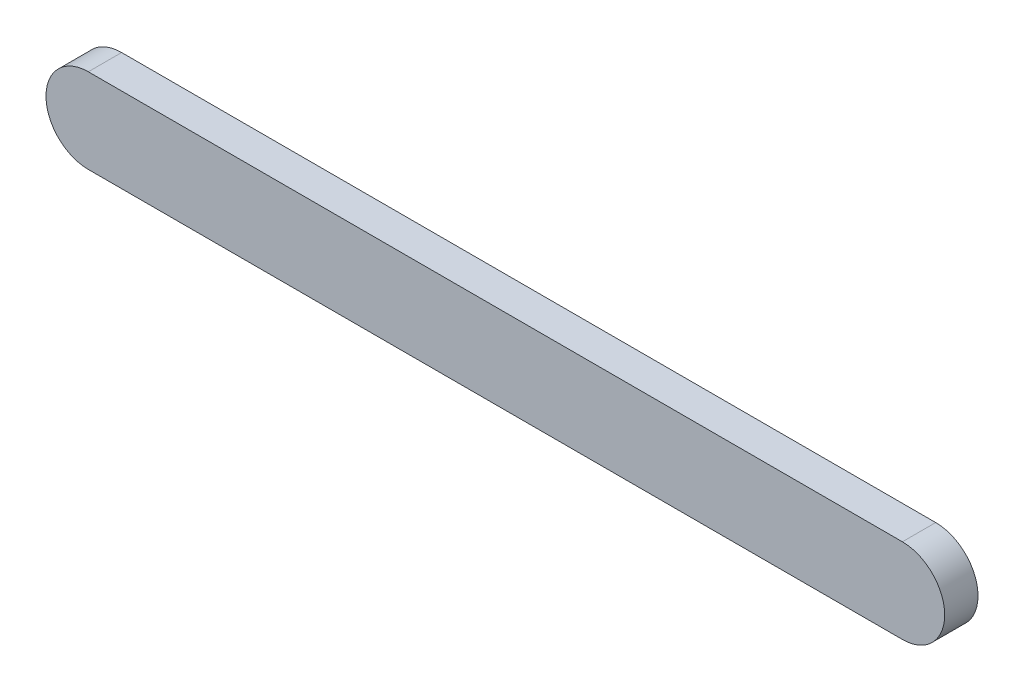
ISO-10303-21;
HEADER;
FILE_DESCRIPTION(('STEP AP214'),'2;1');
FILE_NAME('part.step','',(''),(''),'','','');
FILE_SCHEMA(('AUTOMOTIVE_DESIGN { 1 0 10303 214 1 1 1 1 }'));
ENDSEC;
DATA;
#1=APPLICATION_CONTEXT('core data for automotive mechanical design processes');
#2=APPLICATION_PROTOCOL_DEFINITION('international standard','automotive_design',2000,#1);
#3=PRODUCT_CONTEXT('',#1,'mechanical');
#4=PRODUCT('Part','Part','',(#3));
#5=PRODUCT_RELATED_PRODUCT_CATEGORY('part','',(#4));
#6=PRODUCT_DEFINITION_FORMATION('','',#4);
#7=PRODUCT_DEFINITION_CONTEXT('part definition',#1,'design');
#8=PRODUCT_DEFINITION('design','',#6,#7);
#9=PRODUCT_DEFINITION_SHAPE('','',#8);
#10=(LENGTH_UNIT() NAMED_UNIT(*) SI_UNIT(.MILLI.,.METRE.));
#11=(NAMED_UNIT(*) PLANE_ANGLE_UNIT() SI_UNIT($,.RADIAN.));
#12=(NAMED_UNIT(*) SI_UNIT($,.STERADIAN.) SOLID_ANGLE_UNIT());
#13=UNCERTAINTY_MEASURE_WITH_UNIT(LENGTH_MEASURE(1.E-05),#10,'distance_accuracy_value','');
#14=(GEOMETRIC_REPRESENTATION_CONTEXT(3) GLOBAL_UNCERTAINTY_ASSIGNED_CONTEXT((#13)) GLOBAL_UNIT_ASSIGNED_CONTEXT((#10,
#11,#12)) REPRESENTATION_CONTEXT('',''));
#15=CARTESIAN_POINT('',(0.,0.,0.));
#16=DIRECTION('',(0.,0.,1.));
#17=DIRECTION('',(1.,0.,0.));
#18=AXIS2_PLACEMENT_3D('',#15,#16,#17);
#19=CARTESIAN_POINT('',(93.6894748,60.96,0.));
#20=DIRECTION('',(0.,1.,0.));
#21=DIRECTION('',(1.,0.,0.));
#22=AXIS2_PLACEMENT_3D('',#19,#20,#21);
#23=PLANE('',#22);
#24=DIRECTION('',(1.,0.,0.));
#25=VECTOR('',#24,1.);
#26=CARTESIAN_POINT('',(93.6894748,60.96,0.1999996));
#27=LINE('',#26,#25);
#28=CARTESIAN_POINT('',(93.6894748,60.96,0.1999996));
#29=VERTEX_POINT('',#28);
#30=CARTESIAN_POINT('',(98.5774,60.96,0.1999996));
#31=VERTEX_POINT('',#30);
#32=EDGE_CURVE('E11',#29,#31,#27,.T.);
#33=ORIENTED_EDGE('',*,*,#32,.F.);
#34=DIRECTION('',(0.,0.,1.));
#35=VECTOR('',#34,1.);
#36=CARTESIAN_POINT('',(93.6894748,60.96,0.));
#37=LINE('',#36,#35);
#38=CARTESIAN_POINT('',(93.6894748,60.96,0.));
#39=VERTEX_POINT('',#38);
#40=EDGE_CURVE('E24',#39,#29,#37,.T.);
#41=ORIENTED_EDGE('',*,*,#40,.F.);
#42=DIRECTION('',(1.,0.,0.));
#43=VECTOR('',#42,1.);
#44=CARTESIAN_POINT('',(93.6894748,60.96,0.));
#45=LINE('',#44,#43);
#46=CARTESIAN_POINT('',(98.5774,60.96,0.));
#47=VERTEX_POINT('',#46);
#48=EDGE_CURVE('E75',#39,#47,#45,.T.);
#49=ORIENTED_EDGE('',*,*,#48,.T.);
#50=DIRECTION('',(0.,0.,1.));
#51=VECTOR('',#50,1.);
#52=CARTESIAN_POINT('',(98.5774,60.96,0.));
#53=LINE('',#52,#51);
#54=EDGE_CURVE('E37',#47,#31,#53,.T.);
#55=ORIENTED_EDGE('',*,*,#54,.T.);
#56=EDGE_LOOP('',(#33,#41,#49,#55));
#57=FACE_BOUND('',#56,.T.);
#58=ADVANCED_FACE('F17',(#57),#23,.F.);
#59=CARTESIAN_POINT('',(98.5774,61.214,0.));
#60=DIRECTION('',(0.,0.,-1.));
#61=DIRECTION('',(0.,-1.,0.));
#62=AXIS2_PLACEMENT_3D('',#59,#60,#61);
#63=CYLINDRICAL_SURFACE('',#62,0.254000000000003);
#64=CARTESIAN_POINT('',(98.5774,61.214,0.1999996));
#65=DIRECTION('',(0.,0.,1.));
#66=DIRECTION('',(0.,-1.,0.));
#67=AXIS2_PLACEMENT_3D('',#64,#65,#66);
#68=CIRCLE('',#67,0.254000000000003);
#69=CARTESIAN_POINT('',(98.5774,61.468,0.1999996));
#70=VERTEX_POINT('',#69);
#71=EDGE_CURVE('E83',#31,#70,#68,.T.);
#72=ORIENTED_EDGE('',*,*,#71,.F.);
#73=ORIENTED_EDGE('',*,*,#54,.F.);
#74=CARTESIAN_POINT('',(98.5774,61.214,0.));
#75=DIRECTION('',(0.,0.,1.));
#76=DIRECTION('',(0.,-1.,0.));
#77=AXIS2_PLACEMENT_3D('',#74,#75,#76);
#78=CIRCLE('',#77,0.254000000000003);
#79=CARTESIAN_POINT('',(98.5774,61.468,0.));
#80=VERTEX_POINT('',#79);
#81=EDGE_CURVE('E81',#47,#80,#78,.T.);
#82=ORIENTED_EDGE('',*,*,#81,.T.);
#83=DIRECTION('',(0.,0.,1.));
#84=VECTOR('',#83,1.);
#85=CARTESIAN_POINT('',(98.5774,61.468,0.));
#86=LINE('',#85,#84);
#87=EDGE_CURVE('E67',#80,#70,#86,.T.);
#88=ORIENTED_EDGE('',*,*,#87,.T.);
#89=EDGE_LOOP('',(#72,#73,#82,#88));
#90=FACE_BOUND('',#89,.T.);
#91=ADVANCED_FACE('F89',(#90),#63,.T.);
#92=CARTESIAN_POINT('',(98.5774,61.468,0.));
#93=DIRECTION('',(0.,-1.,0.));
#94=DIRECTION('',(-1.,0.,0.));
#95=AXIS2_PLACEMENT_3D('',#92,#93,#94);
#96=PLANE('',#95);
#97=DIRECTION('',(-1.,0.,0.));
#98=VECTOR('',#97,1.);
#99=CARTESIAN_POINT('',(98.5774,61.468,0.1999996));
#100=LINE('',#99,#98);
#101=CARTESIAN_POINT('',(93.6894748,61.468,0.1999996));
#102=VERTEX_POINT('',#101);
#103=EDGE_CURVE('E71',#70,#102,#100,.T.);
#104=ORIENTED_EDGE('',*,*,#103,.F.);
#105=ORIENTED_EDGE('',*,*,#87,.F.);
#106=DIRECTION('',(-1.,0.,0.));
#107=VECTOR('',#106,1.);
#108=CARTESIAN_POINT('',(98.5774,61.468,0.));
#109=LINE('',#108,#107);
#110=CARTESIAN_POINT('',(93.6894748,61.468,0.));
#111=VERTEX_POINT('',#110);
#112=EDGE_CURVE('E63',#80,#111,#109,.T.);
#113=ORIENTED_EDGE('',*,*,#112,.T.);
#114=DIRECTION('',(0.,0.,1.));
#115=VECTOR('',#114,1.);
#116=CARTESIAN_POINT('',(93.6894748,61.468,0.));
#117=LINE('',#116,#115);
#118=EDGE_CURVE('E53',#111,#102,#117,.T.);
#119=ORIENTED_EDGE('',*,*,#118,.T.);
#120=EDGE_LOOP('',(#104,#105,#113,#119));
#121=FACE_BOUND('',#120,.T.);
#122=ADVANCED_FACE('F66',(#121),#96,.F.);
#123=CARTESIAN_POINT('',(93.6894748,61.214,0.));
#124=DIRECTION('',(0.,0.,-1.));
#125=DIRECTION('',(0.,1.,0.));
#126=AXIS2_PLACEMENT_3D('',#123,#124,#125);
#127=CYLINDRICAL_SURFACE('',#126,0.254000000000003);
#128=CARTESIAN_POINT('',(93.6894748,61.214,0.1999996));
#129=DIRECTION('',(0.,0.,1.));
#130=DIRECTION('',(0.,1.,0.));
#131=AXIS2_PLACEMENT_3D('',#128,#129,#130);
#132=CIRCLE('',#131,0.254000000000003);
#133=EDGE_CURVE('E59',#102,#29,#132,.T.);
#134=ORIENTED_EDGE('',*,*,#133,.F.);
#135=ORIENTED_EDGE('',*,*,#118,.F.);
#136=CARTESIAN_POINT('',(93.6894748,61.214,0.));
#137=DIRECTION('',(0.,0.,1.));
#138=DIRECTION('',(0.,1.,0.));
#139=AXIS2_PLACEMENT_3D('',#136,#137,#138);
#140=CIRCLE('',#139,0.254000000000003);
#141=EDGE_CURVE('E57',#111,#39,#140,.T.);
#142=ORIENTED_EDGE('',*,*,#141,.T.);
#143=ORIENTED_EDGE('',*,*,#40,.T.);
#144=EDGE_LOOP('',(#134,#135,#142,#143));
#145=FACE_BOUND('',#144,.T.);
#146=ADVANCED_FACE('F55',(#145),#127,.T.);
#147=CARTESIAN_POINT('',(93.6894748,60.96,0.));
#148=DIRECTION('',(0.,0.,-1.));
#149=DIRECTION('',(-1.,0.,0.));
#150=AXIS2_PLACEMENT_3D('',#147,#148,#149);
#151=PLANE('',#150);
#152=ORIENTED_EDGE('',*,*,#141,.F.);
#153=ORIENTED_EDGE('',*,*,#112,.F.);
#154=ORIENTED_EDGE('',*,*,#81,.F.);
#155=ORIENTED_EDGE('',*,*,#48,.F.);
#156=EDGE_LOOP('',(#152,#153,#154,#155));
#157=FACE_BOUND('',#156,.T.);
#158=ADVANCED_FACE('F74',(#157),#151,.T.);
#159=CARTESIAN_POINT('',(93.6894748,60.96,0.1999996));
#160=DIRECTION('',(0.,0.,-1.));
#161=DIRECTION('',(-1.,0.,0.));
#162=AXIS2_PLACEMENT_3D('',#159,#160,#161);
#163=PLANE('',#162);
#164=ORIENTED_EDGE('',*,*,#32,.T.);
#165=ORIENTED_EDGE('',*,*,#71,.T.);
#166=ORIENTED_EDGE('',*,*,#103,.T.);
#167=ORIENTED_EDGE('',*,*,#133,.T.);
#168=EDGE_LOOP('',(#164,#165,#166,#167));
#169=FACE_BOUND('',#168,.T.);
#170=ADVANCED_FACE('F91',(#169),#163,.F.);
#171=CLOSED_SHELL('',(#58,#91,#122,#146,#158,#170));
#172=MANIFOLD_SOLID_BREP('B1',#171);
#173=ADVANCED_BREP_SHAPE_REPRESENTATION('',(#18,#172),#14);
#174=SHAPE_DEFINITION_REPRESENTATION(#9,#173);
ENDSEC;
END-ISO-10303-21;
